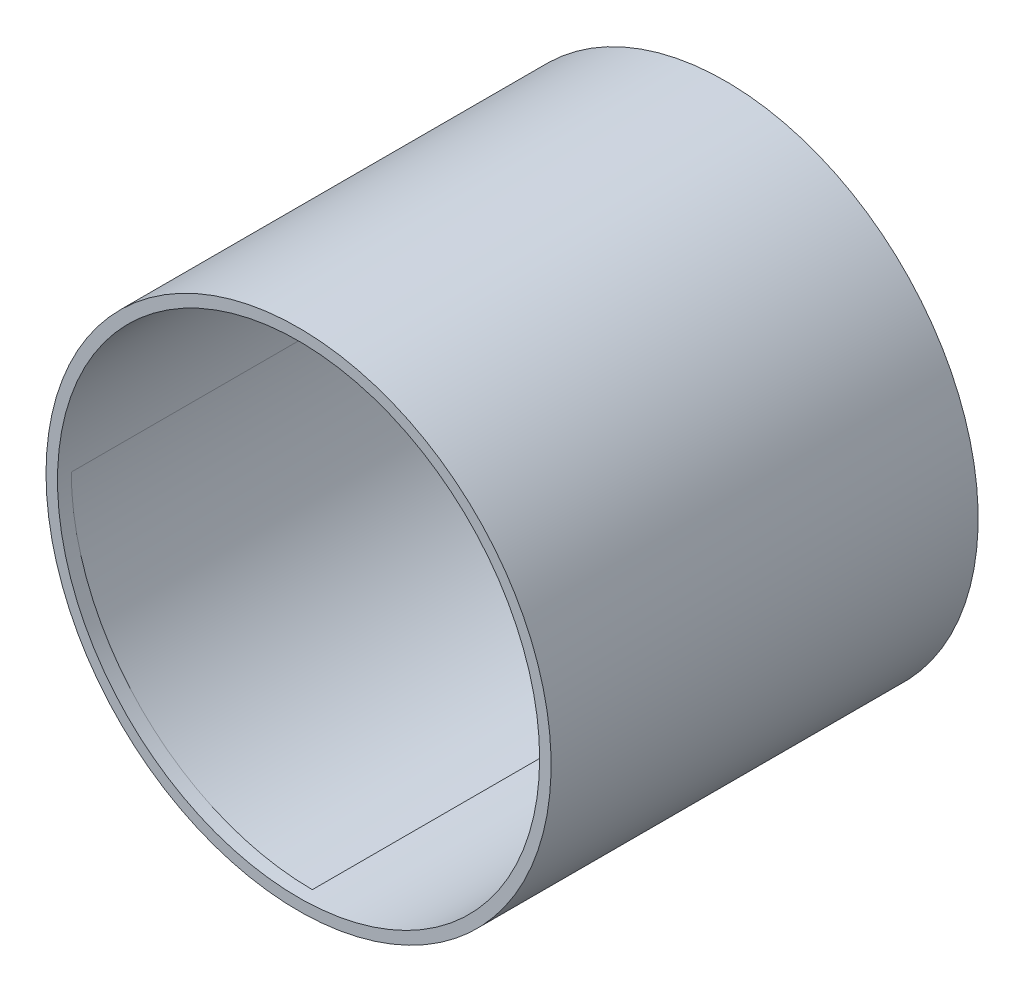
ISO-10303-21;
HEADER;
FILE_DESCRIPTION(('STEP AP214'),'2;1');
FILE_NAME('part.step','',(''),(''),'','','');
FILE_SCHEMA(('AUTOMOTIVE_DESIGN { 1 0 10303 214 1 1 1 1 }'));
ENDSEC;
DATA;
#1=APPLICATION_CONTEXT('core data for automotive mechanical design processes');
#2=APPLICATION_PROTOCOL_DEFINITION('international standard','automotive_design',2000,#1);
#3=PRODUCT_CONTEXT('',#1,'mechanical');
#4=PRODUCT('Part','Part','',(#3));
#5=PRODUCT_RELATED_PRODUCT_CATEGORY('part','',(#4));
#6=PRODUCT_DEFINITION_FORMATION('','',#4);
#7=PRODUCT_DEFINITION_CONTEXT('part definition',#1,'design');
#8=PRODUCT_DEFINITION('design','',#6,#7);
#9=PRODUCT_DEFINITION_SHAPE('','',#8);
#10=(LENGTH_UNIT() NAMED_UNIT(*) SI_UNIT(.MILLI.,.METRE.));
#11=(NAMED_UNIT(*) PLANE_ANGLE_UNIT() SI_UNIT($,.RADIAN.));
#12=(NAMED_UNIT(*) SI_UNIT($,.STERADIAN.) SOLID_ANGLE_UNIT());
#13=UNCERTAINTY_MEASURE_WITH_UNIT(LENGTH_MEASURE(1.E-05),#10,'distance_accuracy_value','');
#14=(GEOMETRIC_REPRESENTATION_CONTEXT(3) GLOBAL_UNCERTAINTY_ASSIGNED_CONTEXT((#13)) GLOBAL_UNIT_ASSIGNED_CONTEXT((#10,
#11,#12)) REPRESENTATION_CONTEXT('',''));
#15=CARTESIAN_POINT('',(0.,0.,0.));
#16=DIRECTION('',(0.,0.,1.));
#17=DIRECTION('',(1.,0.,0.));
#18=AXIS2_PLACEMENT_3D('',#15,#16,#17);
#19=CARTESIAN_POINT('',(0.,0.,93.));
#20=DIRECTION('',(0.,0.,-1.));
#21=DIRECTION('',(-1.,0.,0.));
#22=AXIS2_PLACEMENT_3D('',#19,#20,#21);
#23=CYLINDRICAL_SURFACE('',#22,55.);
#24=CARTESIAN_POINT('',(0.,0.,93.));
#25=DIRECTION('',(0.,0.,1.));
#26=DIRECTION('',(1.,0.,0.));
#27=AXIS2_PLACEMENT_3D('',#24,#25,#26);
#28=CIRCLE('',#27,55.);
#29=CARTESIAN_POINT('',(-55.,0.,93.));
#30=VERTEX_POINT('',#29);
#31=EDGE_CURVE('E140',#30,#30,#28,.T.);
#32=CARTESIAN_POINT('',(0.,0.,0.));
#33=DIRECTION('',(0.,0.,1.));
#34=DIRECTION('',(1.,0.,0.));
#35=AXIS2_PLACEMENT_3D('',#32,#33,#34);
#36=CIRCLE('',#35,55.);
#37=CARTESIAN_POINT('',(-55.,0.,0.));
#38=VERTEX_POINT('',#37);
#39=EDGE_CURVE('E137',#38,#38,#36,.T.);
#40=CARTESIAN_POINT('',(-55.,0.,93.));
#41=CARTESIAN_POINT('',(-55.,0.,92.03125));
#42=CARTESIAN_POINT('',(-55.,0.,91.0625));
#43=CARTESIAN_POINT('',(-55.,0.,89.125));
#44=CARTESIAN_POINT('',(-55.,0.,88.15625));
#45=CARTESIAN_POINT('',(-55.,0.,86.21875));
#46=CARTESIAN_POINT('',(-55.,0.,85.25));
#47=CARTESIAN_POINT('',(-55.,0.,83.3125));
#48=CARTESIAN_POINT('',(-55.,0.,82.34375));
#49=CARTESIAN_POINT('',(-55.,0.,80.40625));
#50=CARTESIAN_POINT('',(-55.,0.,79.4375));
#51=CARTESIAN_POINT('',(-55.,0.,77.5));
#52=CARTESIAN_POINT('',(-55.,0.,76.53125));
#53=CARTESIAN_POINT('',(-55.,0.,74.59375));
#54=CARTESIAN_POINT('',(-55.,0.,73.625));
#55=CARTESIAN_POINT('',(-55.,0.,71.6875));
#56=CARTESIAN_POINT('',(-55.,0.,70.71875));
#57=CARTESIAN_POINT('',(-55.,0.,68.78125));
#58=CARTESIAN_POINT('',(-55.,0.,67.8125));
#59=CARTESIAN_POINT('',(-55.,0.,65.875));
#60=CARTESIAN_POINT('',(-55.,0.,64.90625));
#61=CARTESIAN_POINT('',(-55.,0.,62.96875));
#62=CARTESIAN_POINT('',(-55.,0.,62.));
#63=CARTESIAN_POINT('',(-55.,0.,60.0625));
#64=CARTESIAN_POINT('',(-55.,0.,59.09375));
#65=CARTESIAN_POINT('',(-55.,0.,57.15625));
#66=CARTESIAN_POINT('',(-55.,0.,56.1875));
#67=CARTESIAN_POINT('',(-55.,0.,54.25));
#68=CARTESIAN_POINT('',(-55.,0.,53.28125));
#69=CARTESIAN_POINT('',(-55.,0.,51.34375));
#70=CARTESIAN_POINT('',(-55.,0.,50.375));
#71=CARTESIAN_POINT('',(-55.,0.,48.4375));
#72=CARTESIAN_POINT('',(-55.,0.,47.46875));
#73=CARTESIAN_POINT('',(-55.,0.,45.53125));
#74=CARTESIAN_POINT('',(-55.,0.,44.5625));
#75=CARTESIAN_POINT('',(-55.,0.,42.625));
#76=CARTESIAN_POINT('',(-55.,0.,41.65625));
#77=CARTESIAN_POINT('',(-55.,0.,39.71875));
#78=CARTESIAN_POINT('',(-55.,0.,38.75));
#79=CARTESIAN_POINT('',(-55.,0.,36.8125));
#80=CARTESIAN_POINT('',(-55.,0.,35.84375));
#81=CARTESIAN_POINT('',(-55.,0.,33.90625));
#82=CARTESIAN_POINT('',(-55.,0.,32.9375));
#83=CARTESIAN_POINT('',(-55.,0.,31.));
#84=CARTESIAN_POINT('',(-55.,0.,30.03125));
#85=CARTESIAN_POINT('',(-55.,0.,28.09375));
#86=CARTESIAN_POINT('',(-55.,0.,27.125));
#87=CARTESIAN_POINT('',(-55.,0.,25.1875));
#88=CARTESIAN_POINT('',(-55.,0.,24.21875));
#89=CARTESIAN_POINT('',(-55.,0.,22.28125));
#90=CARTESIAN_POINT('',(-55.,0.,21.3125));
#91=CARTESIAN_POINT('',(-55.,0.,19.375));
#92=CARTESIAN_POINT('',(-55.,0.,18.40625));
#93=CARTESIAN_POINT('',(-55.,0.,16.46875));
#94=CARTESIAN_POINT('',(-55.,0.,15.5));
#95=CARTESIAN_POINT('',(-55.,0.,13.5625));
#96=CARTESIAN_POINT('',(-55.,0.,12.59375));
#97=CARTESIAN_POINT('',(-55.,0.,10.65625));
#98=CARTESIAN_POINT('',(-55.,0.,9.68749999999998));
#99=CARTESIAN_POINT('',(-55.,0.,7.74999999999998));
#100=CARTESIAN_POINT('',(-55.,0.,6.78124999999998));
#101=CARTESIAN_POINT('',(-55.,0.,4.84374999999998));
#102=CARTESIAN_POINT('',(-55.,0.,3.87499999999999));
#103=CARTESIAN_POINT('',(-55.,0.,1.93749999999999));
#104=CARTESIAN_POINT('',(-55.,0.,0.968749999999985));
#105=CARTESIAN_POINT('',(-55.,0.,0.));
#106=B_SPLINE_CURVE_WITH_KNOTS('',3,(#40,#41,#42,#43,#44,#45,#46,#47,#48,#49,#50,#51,#52,#53,
#54,#55,#56,#57,#58,#59,#60,#61,#62,#63,#64,#65,#66,#67,#68,#69,#70,#71,#72,#73,#74,#75,#76,#77,
#78,#79,#80,#81,#82,#83,#84,#85,#86,#87,#88,#89,#90,#91,#92,#93,#94,#95,#96,#97,#98,#99,#100,
#101,#102,#103,#104,#105),.UNSPECIFIED.,.F.,.F.,(4,2,2,2,2,2,2,2,2,2,2,2,2,2,2,2,2,2,2,2,2,2,2,
2,2,2,2,2,2,2,2,2,4),(0.,2.90625000000001,5.81250000000001,8.71875000000001,11.625,14.53125,
17.4375,20.34375,23.25,26.15625,29.0625,31.96875,34.875,37.78125,40.6875,43.59375,46.5,49.40625,
52.3125,55.21875,58.125,61.03125,63.9375,66.84375,69.75,72.65625,75.5625,78.46875,81.375,
84.28125,87.1875,90.09375,93.),.UNSPECIFIED.);
#107=EDGE_CURVE('BSEAM39',#30,#38,#106,.T.);
#108=ORIENTED_EDGE('',*,*,#31,.F.);
#109=ORIENTED_EDGE('',*,*,#39,.T.);
#110=ORIENTED_EDGE('',*,*,#107,.T.);
#111=ORIENTED_EDGE('',*,*,#107,.F.);
#112=EDGE_LOOP('',(#108,#110,#109,#111));
#113=FACE_BOUND('',#112,.T.);
#114=ADVANCED_FACE('F39',(#113),#23,.T.);
#115=CARTESIAN_POINT('',(0.,0.,93.));
#116=DIRECTION('',(0.,0.,1.));
#117=DIRECTION('',(1.,0.,0.));
#118=AXIS2_PLACEMENT_3D('',#115,#116,#117);
#119=PLANE('',#118);
#120=CARTESIAN_POINT('',(0.,0.,93.));
#121=DIRECTION('',(0.,0.,1.));
#122=DIRECTION('',(1.,0.,0.));
#123=AXIS2_PLACEMENT_3D('',#120,#121,#122);
#124=CIRCLE('',#123,52.5);
#125=CARTESIAN_POINT('',(52.5,0.,93.));
#126=VERTEX_POINT('',#125);
#127=EDGE_CURVE('E133',#126,#126,#124,.T.);
#128=ORIENTED_EDGE('',*,*,#127,.F.);
#129=EDGE_LOOP('',(#128));
#130=FACE_BOUND('',#129,.T.);
#131=ORIENTED_EDGE('',*,*,#31,.T.);
#132=EDGE_LOOP('',(#131));
#133=FACE_BOUND('',#132,.T.);
#134=ADVANCED_FACE('F180',(#130,#133),#119,.T.);
#135=CARTESIAN_POINT('',(0.,0.,0.));
#136=DIRECTION('',(0.,0.,1.));
#137=DIRECTION('',(1.,0.,0.));
#138=AXIS2_PLACEMENT_3D('',#135,#136,#137);
#139=PLANE('',#138);
#140=DIRECTION('',(1.,0.,0.));
#141=VECTOR('',#140,1.);
#142=CARTESIAN_POINT('',(-4.72020335973752,0.,0.));
#143=LINE('',#142,#141);
#144=CARTESIAN_POINT('',(-52.7202033597375,0.,0.));
#145=VERTEX_POINT('',#144);
#146=CARTESIAN_POINT('',(-4.72020335973752,0.,0.));
#147=VERTEX_POINT('',#146);
#148=EDGE_CURVE('E111',#145,#147,#143,.T.);
#149=ORIENTED_EDGE('',*,*,#148,.F.);
#150=CARTESIAN_POINT('',(0.0347718474520559,0.,0.));
#151=DIRECTION('',(0.,0.,-1.));
#152=DIRECTION('',(1.,0.,0.));
#153=AXIS2_PLACEMENT_3D('',#150,#151,#152);
#154=CIRCLE('',#153,52.7549752071896);
#155=CARTESIAN_POINT('',(0.,-52.7549637477822,0.));
#156=VERTEX_POINT('',#155);
#157=EDGE_CURVE('E53',#156,#145,#154,.T.);
#158=ORIENTED_EDGE('',*,*,#157,.F.);
#159=DIRECTION('',(0.,-1.,0.));
#160=VECTOR('',#159,1.);
#161=CARTESIAN_POINT('',(0.,-4.75496374778217,0.));
#162=LINE('',#161,#160);
#163=CARTESIAN_POINT('',(0.,-4.75496374778217,0.));
#164=VERTEX_POINT('',#163);
#165=EDGE_CURVE('E100',#164,#156,#162,.T.);
#166=ORIENTED_EDGE('',*,*,#165,.F.);
#167=DIRECTION('',(0.704507964139928,-0.709696081758533,0.));
#168=VECTOR('',#167,1.);
#169=CARTESIAN_POINT('',(-4.72020335973752,0.,0.));
#170=LINE('',#169,#168);
#171=EDGE_CURVE('E106',#147,#164,#170,.T.);
#172=ORIENTED_EDGE('',*,*,#171,.F.);
#173=EDGE_LOOP('',(#149,#158,#166,#172));
#174=FACE_BOUND('',#173,.T.);
#175=CARTESIAN_POINT('',(0.,0.,0.));
#176=DIRECTION('',(0.,0.,-1.));
#177=DIRECTION('',(-1.,0.,0.));
#178=AXIS2_PLACEMENT_3D('',#175,#176,#177);
#179=CIRCLE('',#178,2.5);
#180=CARTESIAN_POINT('',(-2.5,0.,0.));
#181=VERTEX_POINT('',#180);
#182=EDGE_CURVE('E112',#181,#181,#179,.T.);
#183=ORIENTED_EDGE('',*,*,#182,.F.);
#184=EDGE_LOOP('',(#183));
#185=FACE_BOUND('',#184,.T.);
#186=ORIENTED_EDGE('',*,*,#39,.F.);
#187=EDGE_LOOP('',(#186));
#188=FACE_BOUND('',#187,.T.);
#189=ADVANCED_FACE('F109',(#174,#185,#188),#139,.F.);
#190=CARTESIAN_POINT('',(0.,0.,3.));
#191=DIRECTION('',(0.,0.,1.));
#192=DIRECTION('',(1.,0.,0.));
#193=AXIS2_PLACEMENT_3D('',#190,#191,#192);
#194=CYLINDRICAL_SURFACE('',#193,52.5);
#195=CARTESIAN_POINT('',(0.,0.,3.));
#196=DIRECTION('',(0.,0.,1.));
#197=DIRECTION('',(1.,0.,0.));
#198=AXIS2_PLACEMENT_3D('',#195,#196,#197);
#199=CIRCLE('',#198,52.5);
#200=CARTESIAN_POINT('',(0.,-52.5,3.));
#201=VERTEX_POINT('',#200);
#202=CARTESIAN_POINT('',(-52.5,0.,3.));
#203=VERTEX_POINT('',#202);
#204=EDGE_CURVE('E134',#201,#203,#199,.T.);
#205=ORIENTED_EDGE('',*,*,#204,.F.);
#206=DIRECTION('',(0.,0.,1.));
#207=VECTOR('',#206,1.);
#208=CARTESIAN_POINT('',(0.,-52.5,3.));
#209=LINE('',#208,#207);
#210=CARTESIAN_POINT('',(0.,-52.5,90.));
#211=VERTEX_POINT('',#210);
#212=EDGE_CURVE('E130',#201,#211,#209,.T.);
#213=ORIENTED_EDGE('',*,*,#212,.T.);
#214=CARTESIAN_POINT('',(0.,0.,90.));
#215=DIRECTION('',(0.,0.,1.));
#216=DIRECTION('',(1.,0.,0.));
#217=AXIS2_PLACEMENT_3D('',#214,#215,#216);
#218=CIRCLE('',#217,52.5);
#219=CARTESIAN_POINT('',(-52.5,0.,90.));
#220=VERTEX_POINT('',#219);
#221=EDGE_CURVE('E11',#211,#220,#218,.F.);
#222=ORIENTED_EDGE('',*,*,#221,.T.);
#223=DIRECTION('',(0.,0.,1.));
#224=VECTOR('',#223,1.);
#225=CARTESIAN_POINT('',(-52.5,0.,3.));
#226=LINE('',#225,#224);
#227=EDGE_CURVE('E127',#220,#203,#226,.F.);
#228=ORIENTED_EDGE('',*,*,#227,.T.);
#229=EDGE_LOOP('',(#205,#213,#222,#228));
#230=FACE_BOUND('',#229,.T.);
#231=ORIENTED_EDGE('',*,*,#127,.T.);
#232=EDGE_LOOP('',(#231));
#233=FACE_BOUND('',#232,.T.);
#234=ADVANCED_FACE('F163',(#230,#233),#194,.F.);
#235=CARTESIAN_POINT('',(0.,0.,3.));
#236=DIRECTION('',(0.,0.,1.));
#237=DIRECTION('',(1.,0.,0.));
#238=AXIS2_PLACEMENT_3D('',#235,#236,#237);
#239=PLANE('',#238);
#240=DIRECTION('',(0.,1.,0.));
#241=VECTOR('',#240,1.);
#242=CARTESIAN_POINT('',(0.,0.,3.));
#243=LINE('',#242,#241);
#244=CARTESIAN_POINT('',(0.,-4.75496374778217,3.00000000000003));
#245=VERTEX_POINT('',#244);
#246=EDGE_CURVE('E46',#201,#245,#243,.T.);
#247=ORIENTED_EDGE('',*,*,#246,.F.);
#248=ORIENTED_EDGE('',*,*,#204,.T.);
#249=DIRECTION('',(-1.,0.,0.));
#250=VECTOR('',#249,1.);
#251=CARTESIAN_POINT('',(0.,0.,3.));
#252=LINE('',#251,#250);
#253=CARTESIAN_POINT('',(-4.72020335973752,0.,3.));
#254=VERTEX_POINT('',#253);
#255=EDGE_CURVE('E143',#254,#203,#252,.T.);
#256=ORIENTED_EDGE('',*,*,#255,.F.);
#257=DIRECTION('',(-0.704507964139928,0.709696081758533,0.));
#258=VECTOR('',#257,1.);
#259=CARTESIAN_POINT('',(-2.37741788024706,-2.36003815403984,3.));
#260=LINE('',#259,#258);
#261=EDGE_CURVE('E149',#245,#254,#260,.T.);
#262=ORIENTED_EDGE('',*,*,#261,.F.);
#263=EDGE_LOOP('',(#247,#248,#256,#262));
#264=FACE_BOUND('',#263,.T.);
#265=CARTESIAN_POINT('',(0.,0.,3.));
#266=DIRECTION('',(0.,0.,1.));
#267=DIRECTION('',(1.,0.,0.));
#268=AXIS2_PLACEMENT_3D('',#265,#266,#267);
#269=CIRCLE('',#268,2.5);
#270=CARTESIAN_POINT('',(-2.5,0.,2.99999999999999));
#271=VERTEX_POINT('',#270);
#272=EDGE_CURVE('E115',#271,#271,#269,.T.);
#273=ORIENTED_EDGE('',*,*,#272,.F.);
#274=EDGE_LOOP('',(#273));
#275=FACE_BOUND('',#274,.T.);
#276=ADVANCED_FACE('F158',(#264,#275),#239,.T.);
#277=CARTESIAN_POINT('',(0.,0.,90.));
#278=DIRECTION('',(0.,0.,-1.));
#279=DIRECTION('',(-1.,0.,0.));
#280=AXIS2_PLACEMENT_3D('',#277,#278,#279);
#281=CYLINDRICAL_SURFACE('',#280,2.5);
#282=CARTESIAN_POINT('',(-2.5,0.,2.99999999999999));
#283=CARTESIAN_POINT('',(-2.5,0.,2.96874999999999));
#284=CARTESIAN_POINT('',(-2.5,0.,2.93749999999999));
#285=CARTESIAN_POINT('',(-2.5,0.,2.87499999999999));
#286=CARTESIAN_POINT('',(-2.5,0.,2.84374999999999));
#287=CARTESIAN_POINT('',(-2.5,0.,2.78124999999999));
#288=CARTESIAN_POINT('',(-2.5,0.,2.74999999999999));
#289=CARTESIAN_POINT('',(-2.5,0.,2.68749999999999));
#290=CARTESIAN_POINT('',(-2.5,0.,2.65624999999999));
#291=CARTESIAN_POINT('',(-2.5,0.,2.59374999999999));
#292=CARTESIAN_POINT('',(-2.5,0.,2.5625));
#293=CARTESIAN_POINT('',(-2.5,0.,2.5));
#294=CARTESIAN_POINT('',(-2.5,0.,2.46875));
#295=CARTESIAN_POINT('',(-2.5,0.,2.40624999999999));
#296=CARTESIAN_POINT('',(-2.5,0.,2.37499999999999));
#297=CARTESIAN_POINT('',(-2.5,0.,2.31249999999999));
#298=CARTESIAN_POINT('',(-2.5,0.,2.28124999999999));
#299=CARTESIAN_POINT('',(-2.5,0.,2.21874999999999));
#300=CARTESIAN_POINT('',(-2.5,0.,2.1875));
#301=CARTESIAN_POINT('',(-2.5,0.,2.125));
#302=CARTESIAN_POINT('',(-2.5,0.,2.09375));
#303=CARTESIAN_POINT('',(-2.5,0.,2.03124999999999));
#304=CARTESIAN_POINT('',(-2.5,0.,1.99999999999999));
#305=CARTESIAN_POINT('',(-2.5,0.,1.93749999999999));
#306=CARTESIAN_POINT('',(-2.5,0.,1.90625));
#307=CARTESIAN_POINT('',(-2.5,0.,1.84375));
#308=CARTESIAN_POINT('',(-2.5,0.,1.8125));
#309=CARTESIAN_POINT('',(-2.5,0.,1.75));
#310=CARTESIAN_POINT('',(-2.5,0.,1.71875));
#311=CARTESIAN_POINT('',(-2.5,0.,1.65625));
#312=CARTESIAN_POINT('',(-2.5,0.,1.625));
#313=CARTESIAN_POINT('',(-2.5,0.,1.5625));
#314=CARTESIAN_POINT('',(-2.5,0.,1.53125));
#315=CARTESIAN_POINT('',(-2.5,0.,1.46875));
#316=CARTESIAN_POINT('',(-2.5,0.,1.4375));
#317=CARTESIAN_POINT('',(-2.5,0.,1.375));
#318=CARTESIAN_POINT('',(-2.5,0.,1.34375));
#319=CARTESIAN_POINT('',(-2.5,0.,1.28125000000001));
#320=CARTESIAN_POINT('',(-2.5,0.,1.25000000000001));
#321=CARTESIAN_POINT('',(-2.5,0.,1.1875));
#322=CARTESIAN_POINT('',(-2.5,0.,1.15625));
#323=CARTESIAN_POINT('',(-2.5,0.,1.09375));
#324=CARTESIAN_POINT('',(-2.5,0.,1.06250000000001));
#325=CARTESIAN_POINT('',(-2.5,0.,1.00000000000001));
#326=CARTESIAN_POINT('',(-2.5,0.,0.968750000000009));
#327=CARTESIAN_POINT('',(-2.5,0.,0.906250000000007));
#328=CARTESIAN_POINT('',(-2.5,0.,0.875000000000005));
#329=CARTESIAN_POINT('',(-2.5,0.,0.812500000000008));
#330=CARTESIAN_POINT('',(-2.5,0.,0.781250000000011));
#331=CARTESIAN_POINT('',(-2.5,0.,0.718750000000013));
#332=CARTESIAN_POINT('',(-2.5,0.,0.687500000000012));
#333=CARTESIAN_POINT('',(-2.5,0.,0.62500000000001));
#334=CARTESIAN_POINT('',(-2.5,0.,0.593750000000009));
#335=CARTESIAN_POINT('',(-2.5,0.,0.531250000000006));
#336=CARTESIAN_POINT('',(-2.5,0.,0.500000000000005));
#337=CARTESIAN_POINT('',(-2.5,0.,0.437500000000007));
#338=CARTESIAN_POINT('',(-2.5,0.,0.406250000000011));
#339=CARTESIAN_POINT('',(-2.5,0.,0.343750000000013));
#340=CARTESIAN_POINT('',(-2.5,0.,0.312500000000012));
#341=CARTESIAN_POINT('',(-2.5,0.,0.250000000000009));
#342=CARTESIAN_POINT('',(-2.5,0.,0.218750000000008));
#343=CARTESIAN_POINT('',(-2.5,0.,0.156250000000011));
#344=CARTESIAN_POINT('',(-2.5,0.,0.125000000000014));
#345=CARTESIAN_POINT('',(-2.5,0.,0.0625000000000162));
#346=CARTESIAN_POINT('',(-2.5,0.,0.0312500000000151));
#347=CARTESIAN_POINT('',(-2.5,0.,0.));
#348=B_SPLINE_CURVE_WITH_KNOTS('',3,(#282,#283,#284,#285,#286,#287,#288,#289,#290,#291,#292,
#293,#294,#295,#296,#297,#298,#299,#300,#301,#302,#303,#304,#305,#306,#307,#308,#309,#310,#311,
#312,#313,#314,#315,#316,#317,#318,#319,#320,#321,#322,#323,#324,#325,#326,#327,#328,#329,#330,
#331,#332,#333,#334,#335,#336,#337,#338,#339,#340,#341,#342,#343,#344,#345,#346,#347),
.UNSPECIFIED.,.F.,.F.,(4,2,2,2,2,2,2,2,2,2,2,2,2,2,2,2,2,2,2,2,2,2,2,2,2,2,2,2,2,2,2,2,4),(0.,
0.0937500000000036,0.187499999999993,0.281249999999997,0.375,0.46874999999999,0.562499999999994,
0.656249999999997,0.750000000000001,0.84374999999999,0.937499999999994,1.03125,1.12499999999999,
1.21874999999999,1.31249999999999,1.40624999999998,1.49999999999999,1.59374999999999,
1.68749999999998,1.78124999999998,1.87499999999999,1.96874999999998,2.06249999999998,
2.15624999999998,2.24999999999997,2.34374999999998,2.43749999999998,2.53124999999998,
2.62499999999997,2.71874999999998,2.81249999999998,2.90624999999997,2.99999999999998),.UNSPECIFIED.);
#349=EDGE_CURVE('BSEAM170',#271,#181,#348,.T.);
#350=ORIENTED_EDGE('',*,*,#272,.T.);
#351=ORIENTED_EDGE('',*,*,#182,.T.);
#352=ORIENTED_EDGE('',*,*,#349,.T.);
#353=ORIENTED_EDGE('',*,*,#349,.F.);
#354=EDGE_LOOP('',(#350,#352,#351,#353));
#355=FACE_BOUND('',#354,.T.);
#356=ADVANCED_FACE('F170',(#355),#281,.F.);
#357=CARTESIAN_POINT('',(0.0347718474520559,0.,90.));
#358=DIRECTION('',(0.,0.,1.));
#359=DIRECTION('',(1.,0.,0.));
#360=AXIS2_PLACEMENT_3D('',#357,#358,#359);
#361=PLANE('',#360);
#362=DIRECTION('',(0.,-1.,0.));
#363=VECTOR('',#362,1.);
#364=CARTESIAN_POINT('',(0.,-4.75496374778217,90.));
#365=LINE('',#364,#363);
#366=CARTESIAN_POINT('',(0.,-52.7549637477822,90.));
#367=VERTEX_POINT('',#366);
#368=EDGE_CURVE('E120',#211,#367,#365,.T.);
#369=ORIENTED_EDGE('',*,*,#368,.T.);
#370=CARTESIAN_POINT('',(0.0347718474520559,0.,90.));
#371=DIRECTION('',(0.,0.,-1.));
#372=DIRECTION('',(1.,0.,0.));
#373=AXIS2_PLACEMENT_3D('',#370,#371,#372);
#374=CIRCLE('',#373,52.7549752071896);
#375=CARTESIAN_POINT('',(-52.7202033597375,0.,90.));
#376=VERTEX_POINT('',#375);
#377=EDGE_CURVE('E94',#367,#376,#374,.T.);
#378=ORIENTED_EDGE('',*,*,#377,.T.);
#379=DIRECTION('',(1.,0.,0.));
#380=VECTOR('',#379,1.);
#381=CARTESIAN_POINT('',(-4.72020335973752,0.,90.));
#382=LINE('',#381,#380);
#383=EDGE_CURVE('E122',#376,#220,#382,.T.);
#384=ORIENTED_EDGE('',*,*,#383,.T.);
#385=ORIENTED_EDGE('',*,*,#221,.F.);
#386=EDGE_LOOP('',(#369,#378,#384,#385));
#387=FACE_BOUND('',#386,.T.);
#388=ADVANCED_FACE('F166',(#387),#361,.F.);
#389=CARTESIAN_POINT('',(0.,-4.75496374778217,90.));
#390=DIRECTION('',(1.,0.,0.));
#391=DIRECTION('',(0.,1.,0.));
#392=AXIS2_PLACEMENT_3D('',#389,#390,#391);
#393=PLANE('',#392);
#394=ORIENTED_EDGE('',*,*,#246,.T.);
#395=DIRECTION('',(0.,0.,-1.));
#396=VECTOR('',#395,1.);
#397=CARTESIAN_POINT('',(0.,-4.75496374778217,90.));
#398=LINE('',#397,#396);
#399=EDGE_CURVE('E97',#245,#164,#398,.T.);
#400=ORIENTED_EDGE('',*,*,#399,.T.);
#401=ORIENTED_EDGE('',*,*,#165,.T.);
#402=DIRECTION('',(0.,0.,-1.));
#403=VECTOR('',#402,1.);
#404=CARTESIAN_POINT('',(0.,-52.7549637477822,90.));
#405=LINE('',#404,#403);
#406=EDGE_CURVE('E90',#367,#156,#405,.T.);
#407=ORIENTED_EDGE('',*,*,#406,.F.);
#408=ORIENTED_EDGE('',*,*,#368,.F.);
#409=ORIENTED_EDGE('',*,*,#212,.F.);
#410=EDGE_LOOP('',(#394,#400,#401,#407,#408,#409));
#411=FACE_BOUND('',#410,.T.);
#412=ADVANCED_FACE('F101',(#411),#393,.F.);
#413=CARTESIAN_POINT('',(-4.72020335973752,0.,90.));
#414=DIRECTION('',(0.,1.,0.));
#415=DIRECTION('',(0.,0.,1.));
#416=AXIS2_PLACEMENT_3D('',#413,#414,#415);
#417=PLANE('',#416);
#418=ORIENTED_EDGE('',*,*,#383,.F.);
#419=DIRECTION('',(0.,0.,-1.));
#420=VECTOR('',#419,1.);
#421=CARTESIAN_POINT('',(-52.7202033597375,0.,90.));
#422=LINE('',#421,#420);
#423=EDGE_CURVE('E123',#376,#145,#422,.T.);
#424=ORIENTED_EDGE('',*,*,#423,.T.);
#425=ORIENTED_EDGE('',*,*,#148,.T.);
#426=DIRECTION('',(0.,0.,-1.));
#427=VECTOR('',#426,1.);
#428=CARTESIAN_POINT('',(-4.72020335973752,0.,90.));
#429=LINE('',#428,#427);
#430=EDGE_CURVE('E61',#254,#147,#429,.T.);
#431=ORIENTED_EDGE('',*,*,#430,.F.);
#432=ORIENTED_EDGE('',*,*,#255,.T.);
#433=ORIENTED_EDGE('',*,*,#227,.F.);
#434=EDGE_LOOP('',(#418,#424,#425,#431,#432,#433));
#435=FACE_BOUND('',#434,.T.);
#436=ADVANCED_FACE('F161',(#435),#417,.F.);
#437=CARTESIAN_POINT('',(0.0347718474520559,0.,90.));
#438=DIRECTION('',(0.,0.,-1.));
#439=DIRECTION('',(-1.,0.,0.));
#440=AXIS2_PLACEMENT_3D('',#437,#438,#439);
#441=CYLINDRICAL_SURFACE('',#440,52.7549752071896);
#442=ORIENTED_EDGE('',*,*,#157,.T.);
#443=ORIENTED_EDGE('',*,*,#423,.F.);
#444=ORIENTED_EDGE('',*,*,#377,.F.);
#445=ORIENTED_EDGE('',*,*,#406,.T.);
#446=EDGE_LOOP('',(#442,#443,#444,#445));
#447=FACE_BOUND('',#446,.T.);
#448=ADVANCED_FACE('F92',(#447),#441,.F.);
#449=CARTESIAN_POINT('',(-4.72020335973752,0.,90.));
#450=DIRECTION('',(0.709696081758533,0.704507964139928,0.));
#451=DIRECTION('',(-0.704507964139928,0.709696081758533,0.));
#452=AXIS2_PLACEMENT_3D('',#449,#450,#451);
#453=PLANE('',#452);
#454=ORIENTED_EDGE('',*,*,#261,.T.);
#455=ORIENTED_EDGE('',*,*,#430,.T.);
#456=ORIENTED_EDGE('',*,*,#171,.T.);
#457=ORIENTED_EDGE('',*,*,#399,.F.);
#458=EDGE_LOOP('',(#454,#455,#456,#457));
#459=FACE_BOUND('',#458,.T.);
#460=ADVANCED_FACE('F155',(#459),#453,.F.);
#461=CLOSED_SHELL('',(#114,#134,#189,#234,#276,#356,#388,#412,#436,#448,#460));
#462=MANIFOLD_SOLID_BREP('B2',#461);
#463=ADVANCED_BREP_SHAPE_REPRESENTATION('',(#18,#462),#14);
#464=SHAPE_DEFINITION_REPRESENTATION(#9,#463);
ENDSEC;
END-ISO-10303-21;
